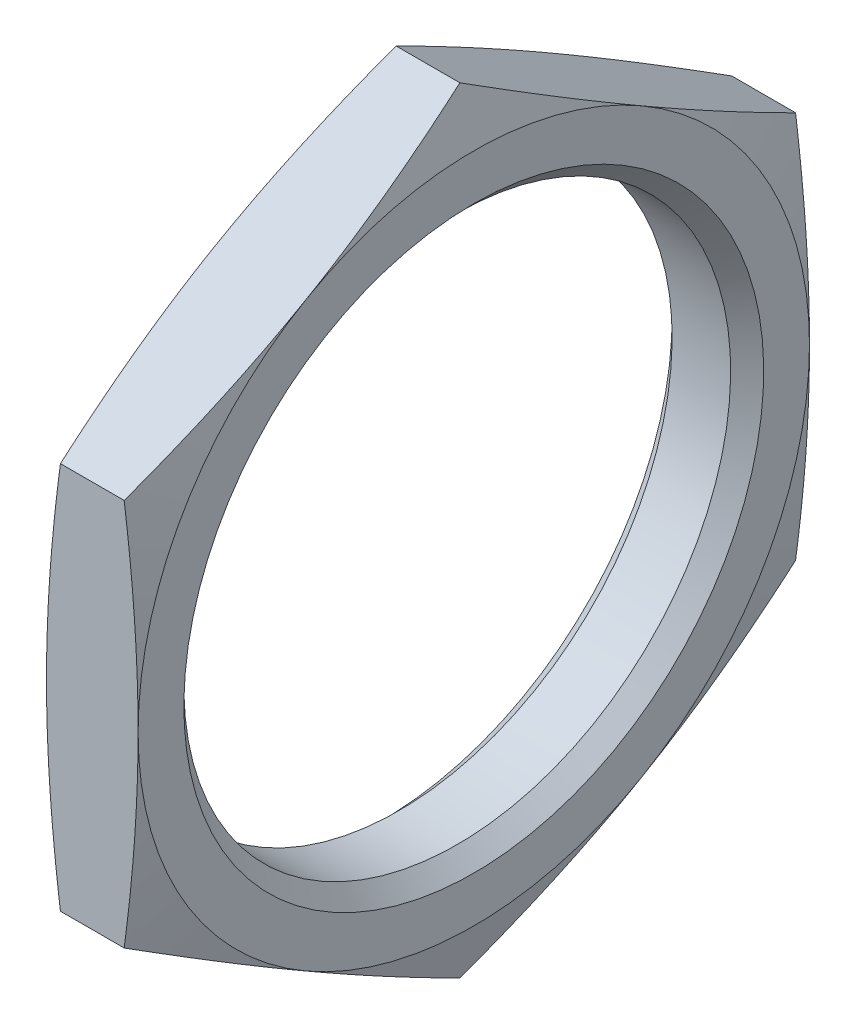
ISO-10303-21;
HEADER;
FILE_DESCRIPTION(('STEP AP214'),'2;1');
FILE_NAME('part.step','',(''),(''),'','','');
FILE_SCHEMA(('AUTOMOTIVE_DESIGN { 1 0 10303 214 1 1 1 1 }'));
ENDSEC;
DATA;
#1=APPLICATION_CONTEXT('core data for automotive mechanical design processes');
#2=APPLICATION_PROTOCOL_DEFINITION('international standard','automotive_design',2000,#1);
#3=PRODUCT_CONTEXT('',#1,'mechanical');
#4=PRODUCT('Part','Part','',(#3));
#5=PRODUCT_RELATED_PRODUCT_CATEGORY('part','',(#4));
#6=PRODUCT_DEFINITION_FORMATION('','',#4);
#7=PRODUCT_DEFINITION_CONTEXT('part definition',#1,'design');
#8=PRODUCT_DEFINITION('design','',#6,#7);
#9=PRODUCT_DEFINITION_SHAPE('','',#8);
#10=(LENGTH_UNIT() NAMED_UNIT(*) SI_UNIT(.MILLI.,.METRE.));
#11=(NAMED_UNIT(*) PLANE_ANGLE_UNIT() SI_UNIT($,.RADIAN.));
#12=(NAMED_UNIT(*) SI_UNIT($,.STERADIAN.) SOLID_ANGLE_UNIT());
#13=UNCERTAINTY_MEASURE_WITH_UNIT(LENGTH_MEASURE(1.E-05),#10,'distance_accuracy_value','');
#14=(GEOMETRIC_REPRESENTATION_CONTEXT(3) GLOBAL_UNCERTAINTY_ASSIGNED_CONTEXT((#13)) GLOBAL_UNIT_ASSIGNED_CONTEXT((#10,
#11,#12)) REPRESENTATION_CONTEXT('',''));
#15=CARTESIAN_POINT('',(0.,0.,0.));
#16=DIRECTION('',(0.,0.,1.));
#17=DIRECTION('',(1.,0.,0.));
#18=AXIS2_PLACEMENT_3D('',#15,#16,#17);
#19=CARTESIAN_POINT('',(0.5,-9.52627944162882,-5.5));
#20=DIRECTION('',(0.,-0.866025403784439,-0.5));
#21=DIRECTION('',(0.,0.5,-0.866025403784439));
#22=AXIS2_PLACEMENT_3D('',#19,#20,#21);
#23=PLANE('',#22);
#24=CARTESIAN_POINT('',(1.95597072760119,-6.35085296108589,-11.));
#25=CARTESIAN_POINT('',(1.5,-8.05255888325766,-8.05255888325764));
#26=CARTESIAN_POINT('',(1.5,-9.52627944162882,-5.5));
#27=(BOUNDED_CURVE() B_SPLINE_CURVE(2,(#24,#25,#26),.UNSPECIFIED.,.F.,
.F.) B_SPLINE_CURVE_WITH_KNOTS((3,3),(0.00593827193247583,6.3774765169875),
.UNSPECIFIED.) CURVE() GEOMETRIC_REPRESENTATION_ITEM() RATIONAL_B_SPLINE_CURVE((1.00007075032021,
1.0379915664716,1.)) REPRESENTATION_ITEM(''));
#28=CARTESIAN_POINT('',(1.95597072760118,-6.35085296108588,-11.));
#29=VERTEX_POINT('',#28);
#30=CARTESIAN_POINT('',(1.5,-9.52627944162882,-5.5));
#31=VERTEX_POINT('',#30);
#32=EDGE_CURVE('E199',#29,#31,#27,.T.);
#33=ORIENTED_EDGE('',*,*,#32,.F.);
#34=DIRECTION('',(1.,0.,0.));
#35=VECTOR('',#34,1.);
#36=CARTESIAN_POINT('',(0.5,-6.35085296108588,-11.));
#37=LINE('',#36,#35);
#38=CARTESIAN_POINT('',(4.04402927239882,-6.35085296108588,-11.));
#39=VERTEX_POINT('',#38);
#40=EDGE_CURVE('E11',#29,#39,#37,.T.);
#41=ORIENTED_EDGE('',*,*,#40,.T.);
#42=CARTESIAN_POINT('',(4.5,-9.52627944162882,-5.5));
#43=CARTESIAN_POINT('',(4.5,-8.05255888325766,-8.05255888325764));
#44=CARTESIAN_POINT('',(4.04402927239882,-6.35085296108589,-11.));
#45=(BOUNDED_CURVE() B_SPLINE_CURVE(2,(#42,#43,#44),.UNSPECIFIED.,.F.,
.F.) B_SPLINE_CURVE_WITH_KNOTS((3,3),(6.3774765169875,12.7490147620425),
.UNSPECIFIED.) CURVE() GEOMETRIC_REPRESENTATION_ITEM() RATIONAL_B_SPLINE_CURVE((1.,
1.03799156647162,1.00007075032021)) REPRESENTATION_ITEM(''));
#46=CARTESIAN_POINT('',(4.5,-9.52627944162882,-5.5));
#47=VERTEX_POINT('',#46);
#48=EDGE_CURVE('E120',#47,#39,#45,.T.);
#49=ORIENTED_EDGE('',*,*,#48,.F.);
#50=CARTESIAN_POINT('',(4.04402927239882,-12.7017059221718,0.));
#51=CARTESIAN_POINT('',(4.5,-11.,-2.94744111674234));
#52=CARTESIAN_POINT('',(4.5,-9.52627944162882,-5.5));
#53=(BOUNDED_CURVE() B_SPLINE_CURVE(2,(#50,#51,#52),.UNSPECIFIED.,.F.,
.F.) B_SPLINE_CURVE_WITH_KNOTS((3,3),(0.00593827193242777,6.3774765169875),
.UNSPECIFIED.) CURVE() GEOMETRIC_REPRESENTATION_ITEM() RATIONAL_B_SPLINE_CURVE((1.00007075032021,
1.03799156647161,1.)) REPRESENTATION_ITEM(''));
#54=CARTESIAN_POINT('',(4.04402927239882,-12.7017059221718,0.));
#55=VERTEX_POINT('',#54);
#56=EDGE_CURVE('E272',#55,#47,#53,.T.);
#57=ORIENTED_EDGE('',*,*,#56,.F.);
#58=DIRECTION('',(1.,0.,0.));
#59=VECTOR('',#58,1.);
#60=CARTESIAN_POINT('',(0.5,-12.7017059221718,0.));
#61=LINE('',#60,#59);
#62=CARTESIAN_POINT('',(1.95597072760118,-12.7017059221718,0.));
#63=VERTEX_POINT('',#62);
#64=EDGE_CURVE('E263',#63,#55,#61,.T.);
#65=ORIENTED_EDGE('',*,*,#64,.F.);
#66=CARTESIAN_POINT('',(1.5,-9.52627944162882,-5.5));
#67=CARTESIAN_POINT('',(1.5,-11.,-2.94744111674234));
#68=CARTESIAN_POINT('',(1.95597072760119,-12.7017059221718,0.));
#69=(BOUNDED_CURVE() B_SPLINE_CURVE(2,(#66,#67,#68),.UNSPECIFIED.,.F.,
.F.) B_SPLINE_CURVE_WITH_KNOTS((3,3),(6.3774765169875,12.7490147620426),
.UNSPECIFIED.) CURVE() GEOMETRIC_REPRESENTATION_ITEM() RATIONAL_B_SPLINE_CURVE((1.,
1.03799156647159,1.00007075032021)) REPRESENTATION_ITEM(''));
#70=EDGE_CURVE('E184',#31,#63,#69,.T.);
#71=ORIENTED_EDGE('',*,*,#70,.F.);
#72=EDGE_LOOP('',(#33,#41,#49,#57,#65,#71));
#73=FACE_BOUND('',#72,.T.);
#74=ADVANCED_FACE('F16',(#73),#23,.T.);
#75=CARTESIAN_POINT('',(0.5,0.,-11.));
#76=DIRECTION('',(0.,0.,-1.));
#77=DIRECTION('',(0.,-1.,0.));
#78=AXIS2_PLACEMENT_3D('',#75,#76,#77);
#79=PLANE('',#78);
#80=CARTESIAN_POINT('',(1.95597072760118,6.3508529610859,-11.));
#81=CARTESIAN_POINT('',(1.5,2.9474411167424,-11.));
#82=CARTESIAN_POINT('',(1.5,0.,-11.));
#83=(BOUNDED_CURVE() B_SPLINE_CURVE(2,(#80,#81,#82),.UNSPECIFIED.,.F.,
.F.) B_SPLINE_CURVE_WITH_KNOTS((3,3),(0.00593827193244825,6.3774765169875),
.UNSPECIFIED.) CURVE() GEOMETRIC_REPRESENTATION_ITEM() RATIONAL_B_SPLINE_CURVE((1.00007075032021,
1.03799156647159,1.)) REPRESENTATION_ITEM(''));
#84=CARTESIAN_POINT('',(1.95597072760118,6.35085296108588,-11.));
#85=VERTEX_POINT('',#84);
#86=CARTESIAN_POINT('',(1.5,0.,-11.));
#87=VERTEX_POINT('',#86);
#88=EDGE_CURVE('E256',#85,#87,#83,.T.);
#89=ORIENTED_EDGE('',*,*,#88,.F.);
#90=DIRECTION('',(1.,0.,0.));
#91=VECTOR('',#90,1.);
#92=CARTESIAN_POINT('',(0.5,6.35085296108588,-11.));
#93=LINE('',#92,#91);
#94=CARTESIAN_POINT('',(4.04402927239882,6.35085296108588,-11.));
#95=VERTEX_POINT('',#94);
#96=EDGE_CURVE('E27',#85,#95,#93,.T.);
#97=ORIENTED_EDGE('',*,*,#96,.T.);
#98=CARTESIAN_POINT('',(4.5,0.,-11.));
#99=CARTESIAN_POINT('',(4.5,2.9474411167424,-11.));
#100=CARTESIAN_POINT('',(4.04402927239882,6.3508529610859,-11.));
#101=(BOUNDED_CURVE() B_SPLINE_CURVE(2,(#98,#99,#100),.UNSPECIFIED.,.F.,
.F.) B_SPLINE_CURVE_WITH_KNOTS((3,3),(6.3774765169875,12.7490147620425),
.UNSPECIFIED.) CURVE() GEOMETRIC_REPRESENTATION_ITEM() RATIONAL_B_SPLINE_CURVE((1.,
1.03799156647158,1.00007075032021)) REPRESENTATION_ITEM(''));
#102=CARTESIAN_POINT('',(4.5,0.,-11.));
#103=VERTEX_POINT('',#102);
#104=EDGE_CURVE('E148',#103,#95,#101,.T.);
#105=ORIENTED_EDGE('',*,*,#104,.F.);
#106=CARTESIAN_POINT('',(4.04402927239882,-6.3508529610859,-11.));
#107=CARTESIAN_POINT('',(4.5,-2.9474411167424,-11.));
#108=CARTESIAN_POINT('',(4.5,0.,-11.));
#109=(BOUNDED_CURVE() B_SPLINE_CURVE(2,(#106,#107,#108),.UNSPECIFIED.,.F.,
.F.) B_SPLINE_CURVE_WITH_KNOTS((3,3),(0.00593827193244835,6.3774765169875),
.UNSPECIFIED.) CURVE() GEOMETRIC_REPRESENTATION_ITEM() RATIONAL_B_SPLINE_CURVE((1.00007075032021,
1.03799156647158,1.)) REPRESENTATION_ITEM(''));
#110=EDGE_CURVE('E192',#39,#103,#109,.T.);
#111=ORIENTED_EDGE('',*,*,#110,.F.);
#112=ORIENTED_EDGE('',*,*,#40,.F.);
#113=CARTESIAN_POINT('',(1.5,0.,-11.));
#114=CARTESIAN_POINT('',(1.5,-2.9474411167424,-11.));
#115=CARTESIAN_POINT('',(1.95597072760119,-6.3508529610859,-11.));
#116=(BOUNDED_CURVE() B_SPLINE_CURVE(2,(#113,#114,#115),.UNSPECIFIED.,.F.,
.F.) B_SPLINE_CURVE_WITH_KNOTS((3,3),(6.3774765169875,12.7490147620425),
.UNSPECIFIED.) CURVE() GEOMETRIC_REPRESENTATION_ITEM() RATIONAL_B_SPLINE_CURVE((1.,
1.03799156647159,1.00007075032021)) REPRESENTATION_ITEM(''));
#117=EDGE_CURVE('E209',#87,#29,#116,.T.);
#118=ORIENTED_EDGE('',*,*,#117,.F.);
#119=EDGE_LOOP('',(#89,#97,#105,#111,#112,#118));
#120=FACE_BOUND('',#119,.T.);
#121=ADVANCED_FACE('F522',(#120),#79,.T.);
#122=CARTESIAN_POINT('',(0.5,9.52627944162882,-5.5));
#123=DIRECTION('',(0.,0.866025403784439,-0.5));
#124=DIRECTION('',(-1.,0.,0.));
#125=AXIS2_PLACEMENT_3D('',#122,#123,#124);
#126=PLANE('',#125);
#127=CARTESIAN_POINT('',(1.95597072760118,12.7017059221718,0.));
#128=CARTESIAN_POINT('',(1.5,11.,-2.94744111674235));
#129=CARTESIAN_POINT('',(1.5,9.52627944162882,-5.5));
#130=(BOUNDED_CURVE() B_SPLINE_CURVE(2,(#127,#128,#129),.UNSPECIFIED.,.F.,
.F.) B_SPLINE_CURVE_WITH_KNOTS((3,3),(0.00593827193242937,6.3774765169875),
.UNSPECIFIED.) CURVE() GEOMETRIC_REPRESENTATION_ITEM() RATIONAL_B_SPLINE_CURVE((1.00007075032021,
1.03799156647161,1.)) REPRESENTATION_ITEM(''));
#131=CARTESIAN_POINT('',(1.95597072760118,12.7017059221718,0.));
#132=VERTEX_POINT('',#131);
#133=CARTESIAN_POINT('',(1.5,9.52627944162882,-5.5));
#134=VERTEX_POINT('',#133);
#135=EDGE_CURVE('E222',#132,#134,#130,.T.);
#136=ORIENTED_EDGE('',*,*,#135,.F.);
#137=DIRECTION('',(1.,0.,0.));
#138=VECTOR('',#137,1.);
#139=CARTESIAN_POINT('',(0.5,12.7017059221718,0.));
#140=LINE('',#139,#138);
#141=CARTESIAN_POINT('',(4.04402927239881,12.7017059221718,0.));
#142=VERTEX_POINT('',#141);
#143=EDGE_CURVE('E243',#132,#142,#140,.T.);
#144=ORIENTED_EDGE('',*,*,#143,.T.);
#145=CARTESIAN_POINT('',(4.5,9.52627944162882,-5.5));
#146=CARTESIAN_POINT('',(4.50000000000001,11.,-2.94744111674235));
#147=CARTESIAN_POINT('',(4.04402927239881,12.7017059221718,0.));
#148=(BOUNDED_CURVE() B_SPLINE_CURVE(2,(#145,#146,#147),.UNSPECIFIED.,.F.,
.F.) B_SPLINE_CURVE_WITH_KNOTS((3,3),(6.3774765169875,12.7490147620426),
.UNSPECIFIED.) CURVE() GEOMETRIC_REPRESENTATION_ITEM() RATIONAL_B_SPLINE_CURVE((1.,
1.03799156647158,1.00007075032021)) REPRESENTATION_ITEM(''));
#149=CARTESIAN_POINT('',(4.5,9.52627944162882,-5.5));
#150=VERTEX_POINT('',#149);
#151=EDGE_CURVE('E346',#150,#142,#148,.T.);
#152=ORIENTED_EDGE('',*,*,#151,.F.);
#153=CARTESIAN_POINT('',(4.04402927239882,6.3508529610859,-11.));
#154=CARTESIAN_POINT('',(4.5,8.05255888325765,-8.05255888325765));
#155=CARTESIAN_POINT('',(4.5,9.52627944162882,-5.5));
#156=(BOUNDED_CURVE() B_SPLINE_CURVE(2,(#153,#154,#155),.UNSPECIFIED.,.F.,
.F.) B_SPLINE_CURVE_WITH_KNOTS((3,3),(0.00593827193247013,6.3774765169875),
.UNSPECIFIED.) CURVE() GEOMETRIC_REPRESENTATION_ITEM() RATIONAL_B_SPLINE_CURVE((1.00007075032021,
1.03799156647158,1.)) REPRESENTATION_ITEM(''));
#157=EDGE_CURVE('E319',#95,#150,#156,.T.);
#158=ORIENTED_EDGE('',*,*,#157,.F.);
#159=ORIENTED_EDGE('',*,*,#96,.F.);
#160=CARTESIAN_POINT('',(1.5,9.52627944162882,-5.5));
#161=CARTESIAN_POINT('',(1.5,8.05255888325764,-8.05255888325764));
#162=CARTESIAN_POINT('',(1.95597072760117,6.35085296108589,-11.));
#163=(BOUNDED_CURVE() B_SPLINE_CURVE(2,(#160,#161,#162),.UNSPECIFIED.,.F.,
.F.) B_SPLINE_CURVE_WITH_KNOTS((3,3),(6.3774765169875,12.7490147620425),
.UNSPECIFIED.) CURVE() GEOMETRIC_REPRESENTATION_ITEM() RATIONAL_B_SPLINE_CURVE((1.,
1.0379915664716,1.00007075032021)) REPRESENTATION_ITEM(''));
#164=EDGE_CURVE('E250',#134,#85,#163,.T.);
#165=ORIENTED_EDGE('',*,*,#164,.F.);
#166=EDGE_LOOP('',(#136,#144,#152,#158,#159,#165));
#167=FACE_BOUND('',#166,.T.);
#168=ADVANCED_FACE('F342',(#167),#126,.T.);
#169=CARTESIAN_POINT('',(0.5,-9.52627944162882,5.5));
#170=DIRECTION('',(0.,-0.866025403784439,0.5));
#171=DIRECTION('',(-1.,0.,0.));
#172=AXIS2_PLACEMENT_3D('',#169,#170,#171);
#173=PLANE('',#172);
#174=CARTESIAN_POINT('',(1.5,-9.52627944162882,5.5));
#175=CARTESIAN_POINT('',(1.5,-8.05255888325765,8.05255888325765));
#176=CARTESIAN_POINT('',(1.95597072760118,-6.35085296108589,11.));
#177=(BOUNDED_CURVE() B_SPLINE_CURVE(2,(#174,#175,#176),.UNSPECIFIED.,.F.,
.F.) B_SPLINE_CURVE_WITH_KNOTS((3,3),(6.3774765169875,12.7490147620425),
.UNSPECIFIED.) CURVE() GEOMETRIC_REPRESENTATION_ITEM() RATIONAL_B_SPLINE_CURVE((1.,
1.03799156647159,1.00007075032021)) REPRESENTATION_ITEM(''));
#178=CARTESIAN_POINT('',(1.5,-9.52627944162882,5.5));
#179=VERTEX_POINT('',#178);
#180=CARTESIAN_POINT('',(1.95597072760118,-6.35085296108588,11.));
#181=VERTEX_POINT('',#180);
#182=EDGE_CURVE('E370',#179,#181,#177,.T.);
#183=ORIENTED_EDGE('',*,*,#182,.F.);
#184=CARTESIAN_POINT('',(1.95597072760119,-12.7017059221718,0.));
#185=CARTESIAN_POINT('',(1.5,-11.,2.94744111674234));
#186=CARTESIAN_POINT('',(1.5,-9.52627944162882,5.5));
#187=(BOUNDED_CURVE() B_SPLINE_CURVE(2,(#184,#185,#186),.UNSPECIFIED.,.F.,
.F.) B_SPLINE_CURVE_WITH_KNOTS((3,3),(0.00593827193243088,6.3774765169875),
.UNSPECIFIED.) CURVE() GEOMETRIC_REPRESENTATION_ITEM() RATIONAL_B_SPLINE_CURVE((1.00007075032021,
1.0379915664716,1.)) REPRESENTATION_ITEM(''));
#188=EDGE_CURVE('E168',#63,#179,#187,.T.);
#189=ORIENTED_EDGE('',*,*,#188,.F.);
#190=ORIENTED_EDGE('',*,*,#64,.T.);
#191=CARTESIAN_POINT('',(4.5,-9.52627944162882,5.5));
#192=CARTESIAN_POINT('',(4.5,-11.,2.94744111674234));
#193=CARTESIAN_POINT('',(4.04402927239882,-12.7017059221718,0.));
#194=(BOUNDED_CURVE() B_SPLINE_CURVE(2,(#191,#192,#193),.UNSPECIFIED.,.F.,
.F.) B_SPLINE_CURVE_WITH_KNOTS((3,3),(6.3774765169875,12.7490147620426),
.UNSPECIFIED.) CURVE() GEOMETRIC_REPRESENTATION_ITEM() RATIONAL_B_SPLINE_CURVE((1.,
1.0379915664716,1.00007075032021)) REPRESENTATION_ITEM(''));
#195=CARTESIAN_POINT('',(4.5,-9.52627944162882,5.5));
#196=VERTEX_POINT('',#195);
#197=EDGE_CURVE('E266',#196,#55,#194,.T.);
#198=ORIENTED_EDGE('',*,*,#197,.F.);
#199=CARTESIAN_POINT('',(4.04402927239882,-6.3508529610859,11.));
#200=CARTESIAN_POINT('',(4.5,-8.05255888325765,8.05255888325764));
#201=CARTESIAN_POINT('',(4.5,-9.52627944162882,5.5));
#202=(BOUNDED_CURVE() B_SPLINE_CURVE(2,(#199,#200,#201),.UNSPECIFIED.,.F.,
.F.) B_SPLINE_CURVE_WITH_KNOTS((3,3),(0.00593827193247,6.3774765169875),
.UNSPECIFIED.) CURVE() GEOMETRIC_REPRESENTATION_ITEM() RATIONAL_B_SPLINE_CURVE((1.00007075032021,
1.0379915664716,1.)) REPRESENTATION_ITEM(''));
#203=CARTESIAN_POINT('',(4.04402927239882,-6.35085296108588,11.));
#204=VERTEX_POINT('',#203);
#205=EDGE_CURVE('E114',#204,#196,#202,.T.);
#206=ORIENTED_EDGE('',*,*,#205,.F.);
#207=DIRECTION('',(1.,0.,0.));
#208=VECTOR('',#207,1.);
#209=CARTESIAN_POINT('',(0.5,-6.35085296108588,11.));
#210=LINE('',#209,#208);
#211=EDGE_CURVE('E130',#181,#204,#210,.T.);
#212=ORIENTED_EDGE('',*,*,#211,.F.);
#213=EDGE_LOOP('',(#183,#189,#190,#198,#206,#212));
#214=FACE_BOUND('',#213,.T.);
#215=ADVANCED_FACE('F453',(#214),#173,.T.);
#216=CARTESIAN_POINT('',(0.5,0.,11.));
#217=DIRECTION('',(0.,0.,1.));
#218=DIRECTION('',(0.,-1.,0.));
#219=AXIS2_PLACEMENT_3D('',#216,#217,#218);
#220=PLANE('',#219);
#221=CARTESIAN_POINT('',(1.5,0.,11.));
#222=CARTESIAN_POINT('',(1.5,2.94744111674241,11.));
#223=CARTESIAN_POINT('',(1.95597072760118,6.35085296108591,11.));
#224=(BOUNDED_CURVE() B_SPLINE_CURVE(2,(#221,#222,#223),.UNSPECIFIED.,.F.,
.F.) B_SPLINE_CURVE_WITH_KNOTS((3,3),(6.3774765169875,12.7490147620426),
.UNSPECIFIED.) CURVE() GEOMETRIC_REPRESENTATION_ITEM() RATIONAL_B_SPLINE_CURVE((1.,
1.0379915664716,1.00007075032021)) REPRESENTATION_ITEM(''));
#225=CARTESIAN_POINT('',(1.5,0.,11.));
#226=VERTEX_POINT('',#225);
#227=CARTESIAN_POINT('',(1.95597072760118,6.35085296108589,11.));
#228=VERTEX_POINT('',#227);
#229=EDGE_CURVE('E257',#226,#228,#224,.T.);
#230=ORIENTED_EDGE('',*,*,#229,.F.);
#231=CARTESIAN_POINT('',(1.95597072760118,-6.3508529610859,11.));
#232=CARTESIAN_POINT('',(1.5,-2.9474411167424,11.));
#233=CARTESIAN_POINT('',(1.5,0.,11.));
#234=(BOUNDED_CURVE() B_SPLINE_CURVE(2,(#231,#232,#233),.UNSPECIFIED.,.F.,
.F.) B_SPLINE_CURVE_WITH_KNOTS((3,3),(0.00593827193243876,6.3774765169875),
.UNSPECIFIED.) CURVE() GEOMETRIC_REPRESENTATION_ITEM() RATIONAL_B_SPLINE_CURVE((1.00007075032021,
1.0379915664716,1.)) REPRESENTATION_ITEM(''));
#235=EDGE_CURVE('E216',#181,#226,#234,.T.);
#236=ORIENTED_EDGE('',*,*,#235,.F.);
#237=ORIENTED_EDGE('',*,*,#211,.T.);
#238=CARTESIAN_POINT('',(4.5,0.,11.));
#239=CARTESIAN_POINT('',(4.5,-2.94744111674239,11.));
#240=CARTESIAN_POINT('',(4.04402927239882,-6.3508529610859,11.));
#241=(BOUNDED_CURVE() B_SPLINE_CURVE(2,(#238,#239,#240),.UNSPECIFIED.,.F.,
.F.) B_SPLINE_CURVE_WITH_KNOTS((3,3),(6.3774765169875,12.7490147620426),
.UNSPECIFIED.) CURVE() GEOMETRIC_REPRESENTATION_ITEM() RATIONAL_B_SPLINE_CURVE((1.,
1.0379915664716,1.00007075032021)) REPRESENTATION_ITEM(''));
#242=CARTESIAN_POINT('',(4.5,0.,11.));
#243=VERTEX_POINT('',#242);
#244=EDGE_CURVE('E111',#243,#204,#241,.T.);
#245=ORIENTED_EDGE('',*,*,#244,.F.);
#246=CARTESIAN_POINT('',(4.04402927239882,6.35085296108591,11.));
#247=CARTESIAN_POINT('',(4.50000000000001,2.9474411167424,11.));
#248=CARTESIAN_POINT('',(4.5,0.,11.));
#249=(BOUNDED_CURVE() B_SPLINE_CURVE(2,(#246,#247,#248),.UNSPECIFIED.,.F.,
.F.) B_SPLINE_CURVE_WITH_KNOTS((3,3),(0.00593827193243842,6.3774765169875),
.UNSPECIFIED.) CURVE() GEOMETRIC_REPRESENTATION_ITEM() RATIONAL_B_SPLINE_CURVE((1.00007075032021,
1.0379915664716,1.)) REPRESENTATION_ITEM(''));
#250=CARTESIAN_POINT('',(4.04402927239881,6.35085296108589,11.));
#251=VERTEX_POINT('',#250);
#252=EDGE_CURVE('E127',#251,#243,#249,.T.);
#253=ORIENTED_EDGE('',*,*,#252,.F.);
#254=DIRECTION('',(1.,0.,0.));
#255=VECTOR('',#254,1.);
#256=CARTESIAN_POINT('',(0.5,6.35085296108589,11.));
#257=LINE('',#256,#255);
#258=EDGE_CURVE('E215',#228,#251,#257,.T.);
#259=ORIENTED_EDGE('',*,*,#258,.F.);
#260=EDGE_LOOP('',(#230,#236,#237,#245,#253,#259));
#261=FACE_BOUND('',#260,.T.);
#262=ADVANCED_FACE('F125',(#261),#220,.T.);
#263=CARTESIAN_POINT('',(0.5,9.52627944162883,5.5));
#264=DIRECTION('',(0.,0.866025403784439,0.5));
#265=DIRECTION('',(1.,0.,0.));
#266=AXIS2_PLACEMENT_3D('',#263,#264,#265);
#267=PLANE('',#266);
#268=CARTESIAN_POINT('',(1.5,9.52627944162883,5.5));
#269=CARTESIAN_POINT('',(1.5,11.,2.94744111674234));
#270=CARTESIAN_POINT('',(1.95597072760118,12.7017059221718,0.));
#271=(BOUNDED_CURVE() B_SPLINE_CURVE(2,(#268,#269,#270),.UNSPECIFIED.,.F.,
.F.) B_SPLINE_CURVE_WITH_KNOTS((3,3),(6.3774765169875,12.7490147620426),
.UNSPECIFIED.) CURVE() GEOMETRIC_REPRESENTATION_ITEM() RATIONAL_B_SPLINE_CURVE((1.,
1.03799156647159,1.00007075032021)) REPRESENTATION_ITEM(''));
#272=CARTESIAN_POINT('',(1.5,9.52627944162883,5.5));
#273=VERTEX_POINT('',#272);
#274=EDGE_CURVE('E288',#273,#132,#271,.T.);
#275=ORIENTED_EDGE('',*,*,#274,.F.);
#276=CARTESIAN_POINT('',(1.95597072760118,6.3508529610859,11.));
#277=CARTESIAN_POINT('',(1.5,8.05255888325765,8.05255888325764));
#278=CARTESIAN_POINT('',(1.5,9.52627944162883,5.5));
#279=(BOUNDED_CURVE() B_SPLINE_CURVE(2,(#276,#277,#278),.UNSPECIFIED.,.F.,
.F.) B_SPLINE_CURVE_WITH_KNOTS((3,3),(0.00593827193247421,6.3774765169875),
.UNSPECIFIED.) CURVE() GEOMETRIC_REPRESENTATION_ITEM() RATIONAL_B_SPLINE_CURVE((1.00007075032021,
1.03799156647161,1.)) REPRESENTATION_ITEM(''));
#280=EDGE_CURVE('E293',#228,#273,#279,.T.);
#281=ORIENTED_EDGE('',*,*,#280,.F.);
#282=ORIENTED_EDGE('',*,*,#258,.T.);
#283=CARTESIAN_POINT('',(4.5,9.52627944162883,5.5));
#284=CARTESIAN_POINT('',(4.5,8.05255888325766,8.05255888325764));
#285=CARTESIAN_POINT('',(4.04402927239882,6.3508529610859,11.));
#286=(BOUNDED_CURVE() B_SPLINE_CURVE(2,(#283,#284,#285),.UNSPECIFIED.,.F.,
.F.) B_SPLINE_CURVE_WITH_KNOTS((3,3),(6.3774765169875,12.7490147620425),
.UNSPECIFIED.) CURVE() GEOMETRIC_REPRESENTATION_ITEM() RATIONAL_B_SPLINE_CURVE((1.,
1.0379915664716,1.00007075032021)) REPRESENTATION_ITEM(''));
#287=CARTESIAN_POINT('',(4.5,9.52627944162883,5.5));
#288=VERTEX_POINT('',#287);
#289=EDGE_CURVE('E132',#288,#251,#286,.T.);
#290=ORIENTED_EDGE('',*,*,#289,.F.);
#291=CARTESIAN_POINT('',(4.04402927239881,12.7017059221718,0.));
#292=CARTESIAN_POINT('',(4.5,11.,2.94744111674234));
#293=CARTESIAN_POINT('',(4.5,9.52627944162883,5.5));
#294=(BOUNDED_CURVE() B_SPLINE_CURVE(2,(#291,#292,#293),.UNSPECIFIED.,.F.,
.F.) B_SPLINE_CURVE_WITH_KNOTS((3,3),(0.00593827193242815,6.3774765169875),
.UNSPECIFIED.) CURVE() GEOMETRIC_REPRESENTATION_ITEM() RATIONAL_B_SPLINE_CURVE((1.00007075032021,
1.03799156647159,1.)) REPRESENTATION_ITEM(''));
#295=EDGE_CURVE('E185',#142,#288,#294,.T.);
#296=ORIENTED_EDGE('',*,*,#295,.F.);
#297=ORIENTED_EDGE('',*,*,#143,.F.);
#298=EDGE_LOOP('',(#275,#281,#282,#290,#296,#297));
#299=FACE_BOUND('',#298,.T.);
#300=ADVANCED_FACE('F469',(#299),#267,.T.);
#301=CARTESIAN_POINT('',(1.5,-10.25,0.));
#302=DIRECTION('',(-1.,0.,0.));
#303=DIRECTION('',(0.,1.,0.));
#304=AXIS2_PLACEMENT_3D('',#301,#302,#303);
#305=PLANE('',#304);
#306=CARTESIAN_POINT('',(1.5,0.,0.));
#307=DIRECTION('',(1.,0.,0.));
#308=DIRECTION('',(0.,-1.,0.));
#309=AXIS2_PLACEMENT_3D('',#306,#307,#308);
#310=CIRCLE('',#309,9.5);
#311=CARTESIAN_POINT('',(1.5,9.5,0.));
#312=VERTEX_POINT('',#311);
#313=EDGE_CURVE('E191',#312,#312,#310,.T.);
#314=ORIENTED_EDGE('',*,*,#313,.T.);
#315=EDGE_LOOP('',(#314));
#316=FACE_BOUND('',#315,.T.);
#317=CARTESIAN_POINT('',(1.5,0.,0.));
#318=DIRECTION('',(1.,0.,0.));
#319=DIRECTION('',(0.,-1.,0.));
#320=AXIS2_PLACEMENT_3D('',#317,#318,#319);
#321=CIRCLE('',#320,11.);
#322=EDGE_CURVE('E162',#179,#31,#321,.T.);
#323=ORIENTED_EDGE('',*,*,#322,.F.);
#324=CARTESIAN_POINT('',(1.5,0.,0.));
#325=DIRECTION('',(1.,0.,0.));
#326=DIRECTION('',(0.,-1.,0.));
#327=AXIS2_PLACEMENT_3D('',#324,#325,#326);
#328=CIRCLE('',#327,11.);
#329=EDGE_CURVE('E160',#226,#179,#328,.T.);
#330=ORIENTED_EDGE('',*,*,#329,.F.);
#331=CARTESIAN_POINT('',(1.5,0.,0.));
#332=DIRECTION('',(1.,0.,0.));
#333=DIRECTION('',(0.,-1.,0.));
#334=AXIS2_PLACEMENT_3D('',#331,#332,#333);
#335=CIRCLE('',#334,11.);
#336=EDGE_CURVE('E289',#273,#226,#335,.T.);
#337=ORIENTED_EDGE('',*,*,#336,.F.);
#338=CARTESIAN_POINT('',(1.5,0.,0.));
#339=DIRECTION('',(1.,0.,0.));
#340=DIRECTION('',(0.,-1.,0.));
#341=AXIS2_PLACEMENT_3D('',#338,#339,#340);
#342=CIRCLE('',#341,11.);
#343=EDGE_CURVE('E167',#134,#273,#342,.T.);
#344=ORIENTED_EDGE('',*,*,#343,.F.);
#345=CARTESIAN_POINT('',(1.5,0.,0.));
#346=DIRECTION('',(1.,0.,0.));
#347=DIRECTION('',(0.,-1.,0.));
#348=AXIS2_PLACEMENT_3D('',#345,#346,#347);
#349=CIRCLE('',#348,11.);
#350=EDGE_CURVE('E234',#87,#134,#349,.T.);
#351=ORIENTED_EDGE('',*,*,#350,.F.);
#352=CARTESIAN_POINT('',(1.5,0.,0.));
#353=DIRECTION('',(1.,0.,0.));
#354=DIRECTION('',(0.,-1.,0.));
#355=AXIS2_PLACEMENT_3D('',#352,#353,#354);
#356=CIRCLE('',#355,11.);
#357=EDGE_CURVE('E208',#31,#87,#356,.T.);
#358=ORIENTED_EDGE('',*,*,#357,.F.);
#359=EDGE_LOOP('',(#323,#330,#337,#344,#351,#358));
#360=FACE_BOUND('',#359,.T.);
#361=ADVANCED_FACE('F446',(#316,#360),#305,.T.);
#362=CARTESIAN_POINT('',(4.5,-10.25,0.));
#363=DIRECTION('',(1.,0.,0.));
#364=DIRECTION('',(0.,1.,0.));
#365=AXIS2_PLACEMENT_3D('',#362,#363,#364);
#366=PLANE('',#365);
#367=CARTESIAN_POINT('',(4.5,0.,0.));
#368=DIRECTION('',(1.,0.,0.));
#369=DIRECTION('',(0.,-1.,0.));
#370=AXIS2_PLACEMENT_3D('',#367,#368,#369);
#371=CIRCLE('',#370,9.5);
#372=CARTESIAN_POINT('',(4.5,9.5,0.));
#373=VERTEX_POINT('',#372);
#374=EDGE_CURVE('E190',#373,#373,#371,.T.);
#375=ORIENTED_EDGE('',*,*,#374,.F.);
#376=EDGE_LOOP('',(#375));
#377=FACE_BOUND('',#376,.T.);
#378=CARTESIAN_POINT('',(4.5,0.,0.));
#379=DIRECTION('',(1.,0.,0.));
#380=DIRECTION('',(0.,-1.,0.));
#381=AXIS2_PLACEMENT_3D('',#378,#379,#380);
#382=CIRCLE('',#381,11.);
#383=EDGE_CURVE('E273',#196,#47,#382,.T.);
#384=ORIENTED_EDGE('',*,*,#383,.T.);
#385=CARTESIAN_POINT('',(4.5,0.,0.));
#386=DIRECTION('',(1.,0.,0.));
#387=DIRECTION('',(0.,-1.,0.));
#388=AXIS2_PLACEMENT_3D('',#385,#386,#387);
#389=CIRCLE('',#388,11.);
#390=EDGE_CURVE('E198',#47,#103,#389,.T.);
#391=ORIENTED_EDGE('',*,*,#390,.T.);
#392=CARTESIAN_POINT('',(4.5,0.,0.));
#393=DIRECTION('',(1.,0.,0.));
#394=DIRECTION('',(0.,-1.,0.));
#395=AXIS2_PLACEMENT_3D('',#392,#393,#394);
#396=CIRCLE('',#395,11.);
#397=EDGE_CURVE('E20',#103,#150,#396,.T.);
#398=ORIENTED_EDGE('',*,*,#397,.T.);
#399=CARTESIAN_POINT('',(4.5,0.,0.));
#400=DIRECTION('',(1.,0.,0.));
#401=DIRECTION('',(0.,-1.,0.));
#402=AXIS2_PLACEMENT_3D('',#399,#400,#401);
#403=CIRCLE('',#402,11.);
#404=EDGE_CURVE('E139',#150,#288,#403,.T.);
#405=ORIENTED_EDGE('',*,*,#404,.T.);
#406=CARTESIAN_POINT('',(4.5,0.,0.));
#407=DIRECTION('',(1.,0.,0.));
#408=DIRECTION('',(0.,-1.,0.));
#409=AXIS2_PLACEMENT_3D('',#406,#407,#408);
#410=CIRCLE('',#409,11.);
#411=EDGE_CURVE('E136',#288,#243,#410,.T.);
#412=ORIENTED_EDGE('',*,*,#411,.T.);
#413=CARTESIAN_POINT('',(4.5,0.,0.));
#414=DIRECTION('',(1.,0.,0.));
#415=DIRECTION('',(0.,-1.,0.));
#416=AXIS2_PLACEMENT_3D('',#413,#414,#415);
#417=CIRCLE('',#416,11.);
#418=EDGE_CURVE('E108',#243,#196,#417,.T.);
#419=ORIENTED_EDGE('',*,*,#418,.T.);
#420=EDGE_LOOP('',(#384,#391,#398,#405,#412,#419));
#421=FACE_BOUND('',#420,.T.);
#422=ADVANCED_FACE('F137',(#377,#421),#366,.T.);
#423=CARTESIAN_POINT('',(4.27157331345247,0.,0.));
#424=DIRECTION('',(-1.,0.,0.));
#425=DIRECTION('',(0.,-1.,0.));
#426=AXIS2_PLACEMENT_3D('',#423,#424,#425);
#427=CONICAL_SURFACE('',#426,11.8525,1.30899693899575);
#428=ORIENTED_EDGE('',*,*,#48,.T.);
#429=ORIENTED_EDGE('',*,*,#110,.T.);
#430=ORIENTED_EDGE('',*,*,#390,.F.);
#431=EDGE_LOOP('',(#428,#429,#430));
#432=FACE_BOUND('',#431,.T.);
#433=ADVANCED_FACE('F502',(#432),#427,.T.);
#434=CARTESIAN_POINT('',(4.27157331345247,0.,0.));
#435=DIRECTION('',(-1.,0.,0.));
#436=DIRECTION('',(0.,-1.,0.));
#437=AXIS2_PLACEMENT_3D('',#434,#435,#436);
#438=CONICAL_SURFACE('',#437,11.8525,1.30899693899575);
#439=ORIENTED_EDGE('',*,*,#244,.T.);
#440=ORIENTED_EDGE('',*,*,#205,.T.);
#441=ORIENTED_EDGE('',*,*,#418,.F.);
#442=EDGE_LOOP('',(#439,#440,#441));
#443=FACE_BOUND('',#442,.T.);
#444=ADVANCED_FACE('F110',(#443),#438,.T.);
#445=CARTESIAN_POINT('',(4.27157331345247,0.,0.));
#446=DIRECTION('',(-1.,0.,0.));
#447=DIRECTION('',(0.,-1.,0.));
#448=AXIS2_PLACEMENT_3D('',#445,#446,#447);
#449=CONICAL_SURFACE('',#448,11.8525,1.30899693899575);
#450=ORIENTED_EDGE('',*,*,#252,.T.);
#451=ORIENTED_EDGE('',*,*,#411,.F.);
#452=ORIENTED_EDGE('',*,*,#289,.T.);
#453=EDGE_LOOP('',(#450,#451,#452));
#454=FACE_BOUND('',#453,.T.);
#455=ADVANCED_FACE('F145',(#454),#449,.T.);
#456=CARTESIAN_POINT('',(4.27157331345247,0.,0.));
#457=DIRECTION('',(-1.,0.,0.));
#458=DIRECTION('',(0.,-1.,0.));
#459=AXIS2_PLACEMENT_3D('',#456,#457,#458);
#460=CONICAL_SURFACE('',#459,11.8525,1.30899693899575);
#461=ORIENTED_EDGE('',*,*,#157,.T.);
#462=ORIENTED_EDGE('',*,*,#397,.F.);
#463=ORIENTED_EDGE('',*,*,#104,.T.);
#464=EDGE_LOOP('',(#461,#462,#463));
#465=FACE_BOUND('',#464,.T.);
#466=ADVANCED_FACE('F335',(#465),#460,.T.);
#467=CARTESIAN_POINT('',(1.72842668654753,0.,0.));
#468=DIRECTION('',(1.,0.,0.));
#469=DIRECTION('',(0.,-1.,0.));
#470=AXIS2_PLACEMENT_3D('',#467,#468,#469);
#471=CONICAL_SURFACE('',#470,11.8525,1.30899693899575);
#472=ORIENTED_EDGE('',*,*,#117,.T.);
#473=ORIENTED_EDGE('',*,*,#32,.T.);
#474=ORIENTED_EDGE('',*,*,#357,.T.);
#475=EDGE_LOOP('',(#472,#473,#474));
#476=FACE_BOUND('',#475,.T.);
#477=ADVANCED_FACE('F18',(#476),#471,.T.);
#478=CARTESIAN_POINT('',(1.72842668654753,0.,0.));
#479=DIRECTION('',(1.,0.,0.));
#480=DIRECTION('',(0.,-1.,0.));
#481=AXIS2_PLACEMENT_3D('',#478,#479,#480);
#482=CONICAL_SURFACE('',#481,11.8525,1.30899693899575);
#483=ORIENTED_EDGE('',*,*,#164,.T.);
#484=ORIENTED_EDGE('',*,*,#88,.T.);
#485=ORIENTED_EDGE('',*,*,#350,.T.);
#486=EDGE_LOOP('',(#483,#484,#485));
#487=FACE_BOUND('',#486,.T.);
#488=ADVANCED_FACE('F479',(#487),#482,.T.);
#489=CARTESIAN_POINT('',(1.72842668654753,0.,0.));
#490=DIRECTION('',(1.,0.,0.));
#491=DIRECTION('',(0.,-1.,0.));
#492=AXIS2_PLACEMENT_3D('',#489,#490,#491);
#493=CONICAL_SURFACE('',#492,11.8525,1.30899693899575);
#494=ORIENTED_EDGE('',*,*,#280,.T.);
#495=ORIENTED_EDGE('',*,*,#336,.T.);
#496=ORIENTED_EDGE('',*,*,#229,.T.);
#497=EDGE_LOOP('',(#494,#495,#496));
#498=FACE_BOUND('',#497,.T.);
#499=ADVANCED_FACE('F472',(#498),#493,.T.);
#500=CARTESIAN_POINT('',(1.72842668654753,0.,0.));
#501=DIRECTION('',(1.,0.,0.));
#502=DIRECTION('',(0.,-1.,0.));
#503=AXIS2_PLACEMENT_3D('',#500,#501,#502);
#504=CONICAL_SURFACE('',#503,11.8525,1.30899693899575);
#505=ORIENTED_EDGE('',*,*,#235,.T.);
#506=ORIENTED_EDGE('',*,*,#329,.T.);
#507=ORIENTED_EDGE('',*,*,#182,.T.);
#508=EDGE_LOOP('',(#505,#506,#507));
#509=FACE_BOUND('',#508,.T.);
#510=ADVANCED_FACE('F439',(#509),#504,.T.);
#511=CARTESIAN_POINT('',(1.72842668654753,0.,0.));
#512=DIRECTION('',(1.,0.,0.));
#513=DIRECTION('',(0.,-1.,0.));
#514=AXIS2_PLACEMENT_3D('',#511,#512,#513);
#515=CONICAL_SURFACE('',#514,11.8525,1.30899693899575);
#516=ORIENTED_EDGE('',*,*,#343,.T.);
#517=ORIENTED_EDGE('',*,*,#274,.T.);
#518=ORIENTED_EDGE('',*,*,#135,.T.);
#519=EDGE_LOOP('',(#516,#517,#518));
#520=FACE_BOUND('',#519,.T.);
#521=ADVANCED_FACE('F477',(#520),#515,.T.);
#522=CARTESIAN_POINT('',(1.72842668654753,0.,0.));
#523=DIRECTION('',(1.,0.,0.));
#524=DIRECTION('',(0.,-1.,0.));
#525=AXIS2_PLACEMENT_3D('',#522,#523,#524);
#526=CONICAL_SURFACE('',#525,11.8525,1.30899693899575);
#527=ORIENTED_EDGE('',*,*,#70,.T.);
#528=ORIENTED_EDGE('',*,*,#188,.T.);
#529=ORIENTED_EDGE('',*,*,#322,.T.);
#530=EDGE_LOOP('',(#527,#528,#529));
#531=FACE_BOUND('',#530,.T.);
#532=ADVANCED_FACE('F451',(#531),#526,.T.);
#533=CARTESIAN_POINT('',(4.27157331345247,0.,0.));
#534=DIRECTION('',(-1.,0.,0.));
#535=DIRECTION('',(0.,-1.,0.));
#536=AXIS2_PLACEMENT_3D('',#533,#534,#535);
#537=CONICAL_SURFACE('',#536,11.8525,1.30899693899575);
#538=ORIENTED_EDGE('',*,*,#151,.T.);
#539=ORIENTED_EDGE('',*,*,#295,.T.);
#540=ORIENTED_EDGE('',*,*,#404,.F.);
#541=EDGE_LOOP('',(#538,#539,#540));
#542=FACE_BOUND('',#541,.T.);
#543=ADVANCED_FACE('F508',(#542),#537,.T.);
#544=CARTESIAN_POINT('',(4.27157331345247,0.,0.));
#545=DIRECTION('',(-1.,0.,0.));
#546=DIRECTION('',(0.,-1.,0.));
#547=AXIS2_PLACEMENT_3D('',#544,#545,#546);
#548=CONICAL_SURFACE('',#547,11.8525,1.30899693899575);
#549=ORIENTED_EDGE('',*,*,#383,.F.);
#550=ORIENTED_EDGE('',*,*,#197,.T.);
#551=ORIENTED_EDGE('',*,*,#56,.T.);
#552=EDGE_LOOP('',(#549,#550,#551));
#553=FACE_BOUND('',#552,.T.);
#554=ADVANCED_FACE('F505',(#553),#548,.T.);
#555=CARTESIAN_POINT('',(4.229375,0.,0.));
#556=DIRECTION('',(1.,0.,0.));
#557=DIRECTION('',(0.,-1.,0.));
#558=AXIS2_PLACEMENT_3D('',#555,#556,#557);
#559=CONICAL_SURFACE('',#558,9.229375,0.785398163397448);
#560=CARTESIAN_POINT('',(3.95875,0.,0.));
#561=DIRECTION('',(1.,0.,0.));
#562=DIRECTION('',(0.,-1.,0.));
#563=AXIS2_PLACEMENT_3D('',#560,#561,#562);
#564=CIRCLE('',#563,8.95875);
#565=CARTESIAN_POINT('',(3.95875,8.95875,0.));
#566=VERTEX_POINT('',#565);
#567=EDGE_CURVE('E186',#566,#566,#564,.T.);
#568=ORIENTED_EDGE('',*,*,#567,.F.);
#569=EDGE_LOOP('',(#568));
#570=FACE_BOUND('',#569,.T.);
#571=ORIENTED_EDGE('',*,*,#374,.T.);
#572=EDGE_LOOP('',(#571));
#573=FACE_BOUND('',#572,.T.);
#574=ADVANCED_FACE('F507',(#570,#573),#559,.F.);
#575=CARTESIAN_POINT('',(3.,0.,0.));
#576=DIRECTION('',(1.,0.,0.));
#577=DIRECTION('',(0.,-1.,0.));
#578=AXIS2_PLACEMENT_3D('',#575,#576,#577);
#579=CYLINDRICAL_SURFACE('',#578,8.95875);
#580=CARTESIAN_POINT('',(2.04125,0.,0.));
#581=DIRECTION('',(1.,0.,0.));
#582=DIRECTION('',(0.,-1.,0.));
#583=AXIS2_PLACEMENT_3D('',#580,#581,#582);
#584=CIRCLE('',#583,8.95875);
#585=CARTESIAN_POINT('',(2.04125,8.95875,0.));
#586=VERTEX_POINT('',#585);
#587=EDGE_CURVE('E223',#586,#586,#584,.T.);
#588=ORIENTED_EDGE('',*,*,#587,.F.);
#589=EDGE_LOOP('',(#588));
#590=FACE_BOUND('',#589,.T.);
#591=ORIENTED_EDGE('',*,*,#567,.T.);
#592=EDGE_LOOP('',(#591));
#593=FACE_BOUND('',#592,.T.);
#594=ADVANCED_FACE('F515',(#590,#593),#579,.F.);
#595=CARTESIAN_POINT('',(1.770625,0.,0.));
#596=DIRECTION('',(-1.,0.,0.));
#597=DIRECTION('',(0.,-1.,0.));
#598=AXIS2_PLACEMENT_3D('',#595,#596,#597);
#599=CONICAL_SURFACE('',#598,9.229375,0.785398163397448);
#600=ORIENTED_EDGE('',*,*,#313,.F.);
#601=EDGE_LOOP('',(#600));
#602=FACE_BOUND('',#601,.T.);
#603=ORIENTED_EDGE('',*,*,#587,.T.);
#604=EDGE_LOOP('',(#603));
#605=FACE_BOUND('',#604,.T.);
#606=ADVANCED_FACE('F656',(#602,#605),#599,.F.);
#607=CLOSED_SHELL('',(#74,#121,#168,#215,#262,#300,#361,#422,#433,#444,#455,#466,#477,#488,#499,
#510,#521,#532,#543,#554,#574,#594,#606));
#608=MANIFOLD_SOLID_BREP('B1',#607);
#609=ADVANCED_BREP_SHAPE_REPRESENTATION('',(#18,#608),#14);
#610=SHAPE_DEFINITION_REPRESENTATION(#9,#609);
ENDSEC;
END-ISO-10303-21;
